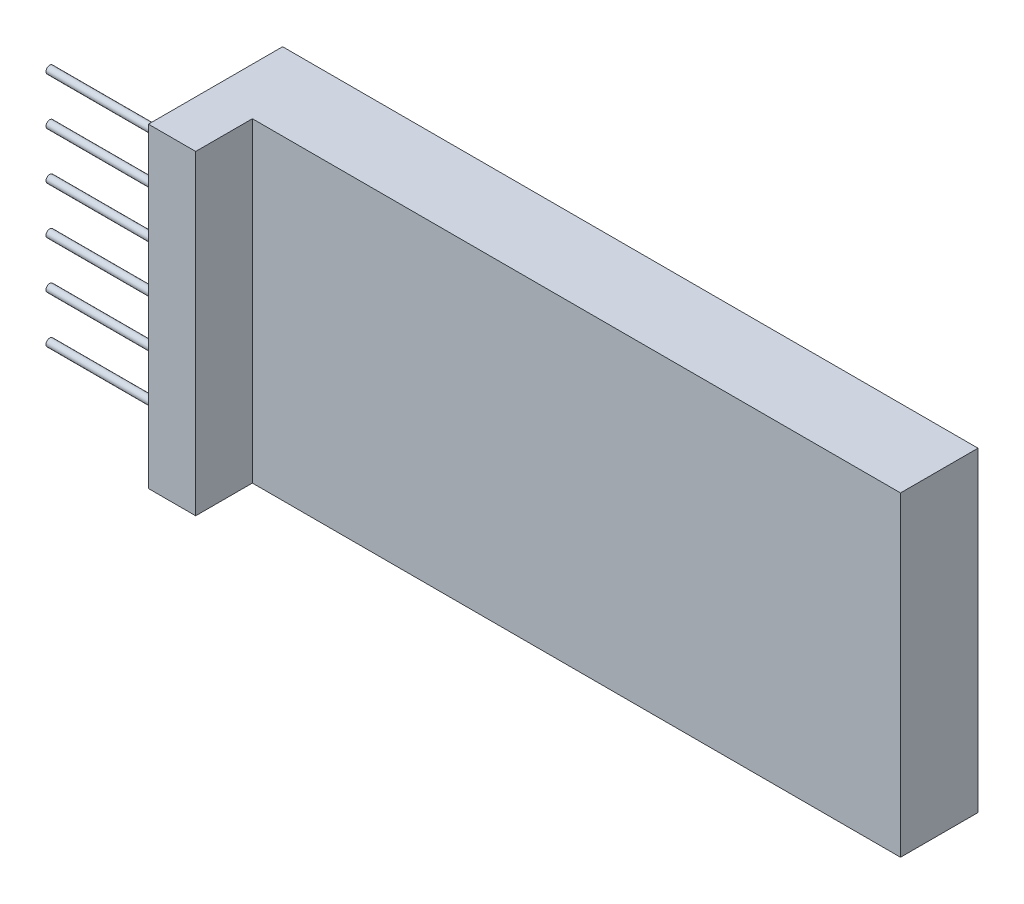
ISO-10303-21;
HEADER;
FILE_DESCRIPTION(('STEP AP214'),'2;1');
FILE_NAME('part.step','',(''),(''),'','','');
FILE_SCHEMA(('AUTOMOTIVE_DESIGN { 1 0 10303 214 1 1 1 1 }'));
ENDSEC;
DATA;
#1=APPLICATION_CONTEXT('core data for automotive mechanical design processes');
#2=APPLICATION_PROTOCOL_DEFINITION('international standard','automotive_design',2000,#1);
#3=PRODUCT_CONTEXT('',#1,'mechanical');
#4=PRODUCT('Part','Part','',(#3));
#5=PRODUCT_RELATED_PRODUCT_CATEGORY('part','',(#4));
#6=PRODUCT_DEFINITION_FORMATION('','',#4);
#7=PRODUCT_DEFINITION_CONTEXT('part definition',#1,'design');
#8=PRODUCT_DEFINITION('design','',#6,#7);
#9=PRODUCT_DEFINITION_SHAPE('','',#8);
#10=(LENGTH_UNIT() NAMED_UNIT(*) SI_UNIT(.MILLI.,.METRE.));
#11=(NAMED_UNIT(*) PLANE_ANGLE_UNIT() SI_UNIT($,.RADIAN.));
#12=(NAMED_UNIT(*) SI_UNIT($,.STERADIAN.) SOLID_ANGLE_UNIT());
#13=UNCERTAINTY_MEASURE_WITH_UNIT(LENGTH_MEASURE(1.E-05),#10,'distance_accuracy_value','');
#14=(GEOMETRIC_REPRESENTATION_CONTEXT(3) GLOBAL_UNCERTAINTY_ASSIGNED_CONTEXT((#13)) GLOBAL_UNIT_ASSIGNED_CONTEXT((#10,
#11,#12)) REPRESENTATION_CONTEXT('',''));
#15=CARTESIAN_POINT('',(0.,0.,0.));
#16=DIRECTION('',(0.,0.,1.));
#17=DIRECTION('',(1.,0.,0.));
#18=AXIS2_PLACEMENT_3D('',#15,#16,#17);
#19=CARTESIAN_POINT('',(0.,0.,4.1));
#20=DIRECTION('',(0.,0.,-1.));
#21=DIRECTION('',(-1.,0.,0.));
#22=AXIS2_PLACEMENT_3D('',#19,#20,#21);
#23=PLANE('',#22);
#24=DIRECTION('',(0.,1.,0.));
#25=VECTOR('',#24,1.);
#26=CARTESIAN_POINT('',(2.5,16.7,4.1));
#27=LINE('',#26,#25);
#28=CARTESIAN_POINT('',(2.5,0.,4.1));
#29=VERTEX_POINT('',#28);
#30=CARTESIAN_POINT('',(2.5,16.7,4.1));
#31=VERTEX_POINT('',#30);
#32=EDGE_CURVE('E50',#29,#31,#27,.T.);
#33=ORIENTED_EDGE('',*,*,#32,.F.);
#34=DIRECTION('',(1.,0.,0.));
#35=VECTOR('',#34,1.);
#36=CARTESIAN_POINT('',(0.,0.,4.1));
#37=LINE('',#36,#35);
#38=CARTESIAN_POINT('',(36.8,0.,4.1));
#39=VERTEX_POINT('',#38);
#40=EDGE_CURVE('E87',#29,#39,#37,.T.);
#41=ORIENTED_EDGE('',*,*,#40,.T.);
#42=DIRECTION('',(0.,1.,0.));
#43=VECTOR('',#42,1.);
#44=CARTESIAN_POINT('',(36.8,0.,4.1));
#45=LINE('',#44,#43);
#46=CARTESIAN_POINT('',(36.8,16.7,4.1));
#47=VERTEX_POINT('',#46);
#48=EDGE_CURVE('E56',#39,#47,#45,.T.);
#49=ORIENTED_EDGE('',*,*,#48,.T.);
#50=DIRECTION('',(-1.,0.,0.));
#51=VECTOR('',#50,1.);
#52=CARTESIAN_POINT('',(0.,16.7,4.1));
#53=LINE('',#52,#51);
#54=EDGE_CURVE('E97',#47,#31,#53,.T.);
#55=ORIENTED_EDGE('',*,*,#54,.T.);
#56=EDGE_LOOP('',(#33,#41,#49,#55));
#57=FACE_BOUND('',#56,.T.);
#58=ADVANCED_FACE('F35',(#57),#23,.F.);
#59=CARTESIAN_POINT('',(0.,0.,4.1));
#60=DIRECTION('',(1.,0.,0.));
#61=DIRECTION('',(0.,0.,-1.));
#62=AXIS2_PLACEMENT_3D('',#59,#60,#61);
#63=PLANE('',#62);
#64=CARTESIAN_POINT('',(0.,2.66451848105115,5.67130025329441));
#65=DIRECTION('',(1.,0.,0.));
#66=DIRECTION('',(0.,0.,-1.));
#67=AXIS2_PLACEMENT_3D('',#64,#65,#66);
#68=CIRCLE('',#67,0.2);
#69=CARTESIAN_POINT('',(0.,2.66451848105115,5.47130025329441));
#70=VERTEX_POINT('',#69);
#71=EDGE_CURVE('E11',#70,#70,#68,.F.);
#72=ORIENTED_EDGE('',*,*,#71,.F.);
#73=EDGE_LOOP('',(#72));
#74=FACE_BOUND('',#73,.T.);
#75=CARTESIAN_POINT('',(0.,5.16451848105115,5.67130025329439));
#76=DIRECTION('',(1.,0.,0.));
#77=DIRECTION('',(0.,0.,-1.));
#78=AXIS2_PLACEMENT_3D('',#75,#76,#77);
#79=CIRCLE('',#78,0.2);
#80=CARTESIAN_POINT('',(0.,5.16451848105115,5.47130025329439));
#81=VERTEX_POINT('',#80);
#82=EDGE_CURVE('E43',#81,#81,#79,.F.);
#83=ORIENTED_EDGE('',*,*,#82,.F.);
#84=EDGE_LOOP('',(#83));
#85=FACE_BOUND('',#84,.T.);
#86=CARTESIAN_POINT('',(0.,7.66451848105115,5.67130025329436));
#87=DIRECTION('',(1.,0.,0.));
#88=DIRECTION('',(0.,0.,-1.));
#89=AXIS2_PLACEMENT_3D('',#86,#87,#88);
#90=CIRCLE('',#89,0.2);
#91=CARTESIAN_POINT('',(0.,7.66451848105115,5.47130025329436));
#92=VERTEX_POINT('',#91);
#93=EDGE_CURVE('E127',#92,#92,#90,.F.);
#94=ORIENTED_EDGE('',*,*,#93,.F.);
#95=EDGE_LOOP('',(#94));
#96=FACE_BOUND('',#95,.T.);
#97=CARTESIAN_POINT('',(0.,10.1645184810511,5.67130025329433));
#98=DIRECTION('',(1.,0.,0.));
#99=DIRECTION('',(0.,0.,-1.));
#100=AXIS2_PLACEMENT_3D('',#97,#98,#99);
#101=CIRCLE('',#100,0.199999999999999);
#102=CARTESIAN_POINT('',(0.,10.1645184810511,5.47130025329433));
#103=VERTEX_POINT('',#102);
#104=EDGE_CURVE('E124',#103,#103,#101,.F.);
#105=ORIENTED_EDGE('',*,*,#104,.F.);
#106=EDGE_LOOP('',(#105));
#107=FACE_BOUND('',#106,.T.);
#108=CARTESIAN_POINT('',(0.,12.6645184810511,5.67130025329431));
#109=DIRECTION('',(1.,0.,0.));
#110=DIRECTION('',(0.,0.,-1.));
#111=AXIS2_PLACEMENT_3D('',#108,#109,#110);
#112=CIRCLE('',#111,0.2);
#113=CARTESIAN_POINT('',(0.,12.6645184810511,5.47130025329431));
#114=VERTEX_POINT('',#113);
#115=EDGE_CURVE('E121',#114,#114,#112,.F.);
#116=ORIENTED_EDGE('',*,*,#115,.F.);
#117=EDGE_LOOP('',(#116));
#118=FACE_BOUND('',#117,.T.);
#119=CARTESIAN_POINT('',(0.,15.1645184810511,5.67130025329428));
#120=DIRECTION('',(1.,0.,0.));
#121=DIRECTION('',(0.,0.,-1.));
#122=AXIS2_PLACEMENT_3D('',#119,#120,#121);
#123=CIRCLE('',#122,0.2);
#124=CARTESIAN_POINT('',(0.,15.1645184810511,5.47130025329428));
#125=VERTEX_POINT('',#124);
#126=EDGE_CURVE('E118',#125,#125,#123,.F.);
#127=ORIENTED_EDGE('',*,*,#126,.F.);
#128=EDGE_LOOP('',(#127));
#129=FACE_BOUND('',#128,.T.);
#130=DIRECTION('',(0.,-1.,0.));
#131=VECTOR('',#130,1.);
#132=CARTESIAN_POINT('',(0.,0.,0.));
#133=LINE('',#132,#131);
#134=CARTESIAN_POINT('',(0.,16.7,0.));
#135=VERTEX_POINT('',#134);
#136=CARTESIAN_POINT('',(0.,0.,0.));
#137=VERTEX_POINT('',#136);
#138=EDGE_CURVE('E94',#135,#137,#133,.T.);
#139=ORIENTED_EDGE('',*,*,#138,.T.);
#140=DIRECTION('',(0.,0.,-1.));
#141=VECTOR('',#140,1.);
#142=CARTESIAN_POINT('',(0.,0.,4.1));
#143=LINE('',#142,#141);
#144=CARTESIAN_POINT('',(0.,0.,7.1));
#145=VERTEX_POINT('',#144);
#146=EDGE_CURVE('E116',#145,#137,#143,.T.);
#147=ORIENTED_EDGE('',*,*,#146,.F.);
#148=DIRECTION('',(0.,-1.,0.));
#149=VECTOR('',#148,1.);
#150=CARTESIAN_POINT('',(0.,16.7,7.1));
#151=LINE('',#150,#149);
#152=CARTESIAN_POINT('',(0.,16.7,7.1));
#153=VERTEX_POINT('',#152);
#154=EDGE_CURVE('E96',#153,#145,#151,.T.);
#155=ORIENTED_EDGE('',*,*,#154,.F.);
#156=DIRECTION('',(0.,0.,-1.));
#157=VECTOR('',#156,1.);
#158=CARTESIAN_POINT('',(0.,16.7,4.1));
#159=LINE('',#158,#157);
#160=EDGE_CURVE('E80',#153,#135,#159,.T.);
#161=ORIENTED_EDGE('',*,*,#160,.T.);
#162=EDGE_LOOP('',(#139,#147,#155,#161));
#163=FACE_BOUND('',#162,.T.);
#164=ADVANCED_FACE('F37',(#74,#85,#96,#107,#118,#129,#163),#63,.F.);
#165=CARTESIAN_POINT('',(0.,0.,4.1));
#166=DIRECTION('',(0.,1.,0.));
#167=DIRECTION('',(0.,0.,1.));
#168=AXIS2_PLACEMENT_3D('',#165,#166,#167);
#169=PLANE('',#168);
#170=DIRECTION('',(1.,0.,0.));
#171=VECTOR('',#170,1.);
#172=CARTESIAN_POINT('',(0.,0.,0.));
#173=LINE('',#172,#171);
#174=CARTESIAN_POINT('',(36.8,0.,0.));
#175=VERTEX_POINT('',#174);
#176=EDGE_CURVE('E100',#137,#175,#173,.T.);
#177=ORIENTED_EDGE('',*,*,#176,.T.);
#178=DIRECTION('',(0.,0.,-1.));
#179=VECTOR('',#178,1.);
#180=CARTESIAN_POINT('',(36.8,0.,4.1));
#181=LINE('',#180,#179);
#182=EDGE_CURVE('E113',#39,#175,#181,.T.);
#183=ORIENTED_EDGE('',*,*,#182,.F.);
#184=ORIENTED_EDGE('',*,*,#40,.F.);
#185=DIRECTION('',(0.,0.,-1.));
#186=VECTOR('',#185,1.);
#187=CARTESIAN_POINT('',(2.5,0.,7.1));
#188=LINE('',#187,#186);
#189=CARTESIAN_POINT('',(2.5,0.,7.1));
#190=VERTEX_POINT('',#189);
#191=EDGE_CURVE('E102',#190,#29,#188,.T.);
#192=ORIENTED_EDGE('',*,*,#191,.F.);
#193=DIRECTION('',(1.,0.,0.));
#194=VECTOR('',#193,1.);
#195=CARTESIAN_POINT('',(0.,0.,7.1));
#196=LINE('',#195,#194);
#197=EDGE_CURVE('E193',#145,#190,#196,.T.);
#198=ORIENTED_EDGE('',*,*,#197,.F.);
#199=ORIENTED_EDGE('',*,*,#146,.T.);
#200=EDGE_LOOP('',(#177,#183,#184,#192,#198,#199));
#201=FACE_BOUND('',#200,.T.);
#202=ADVANCED_FACE('F136',(#201),#169,.F.);
#203=CARTESIAN_POINT('',(36.8,0.,4.1));
#204=DIRECTION('',(-1.,0.,0.));
#205=DIRECTION('',(0.,0.,1.));
#206=AXIS2_PLACEMENT_3D('',#203,#204,#205);
#207=PLANE('',#206);
#208=DIRECTION('',(0.,1.,0.));
#209=VECTOR('',#208,1.);
#210=CARTESIAN_POINT('',(36.8,0.,0.));
#211=LINE('',#210,#209);
#212=CARTESIAN_POINT('',(36.8,16.7,0.));
#213=VERTEX_POINT('',#212);
#214=EDGE_CURVE('E88',#175,#213,#211,.T.);
#215=ORIENTED_EDGE('',*,*,#214,.T.);
#216=DIRECTION('',(0.,0.,-1.));
#217=VECTOR('',#216,1.);
#218=CARTESIAN_POINT('',(36.8,16.7,4.1));
#219=LINE('',#218,#217);
#220=EDGE_CURVE('E83',#47,#213,#219,.T.);
#221=ORIENTED_EDGE('',*,*,#220,.F.);
#222=ORIENTED_EDGE('',*,*,#48,.F.);
#223=ORIENTED_EDGE('',*,*,#182,.T.);
#224=EDGE_LOOP('',(#215,#221,#222,#223));
#225=FACE_BOUND('',#224,.T.);
#226=ADVANCED_FACE('F173',(#225),#207,.F.);
#227=CARTESIAN_POINT('',(0.,16.7,4.1));
#228=DIRECTION('',(0.,-1.,0.));
#229=DIRECTION('',(0.,0.,-1.));
#230=AXIS2_PLACEMENT_3D('',#227,#228,#229);
#231=PLANE('',#230);
#232=DIRECTION('',(-1.,0.,0.));
#233=VECTOR('',#232,1.);
#234=CARTESIAN_POINT('',(0.,16.7,0.));
#235=LINE('',#234,#233);
#236=EDGE_CURVE('E76',#213,#135,#235,.T.);
#237=ORIENTED_EDGE('',*,*,#236,.T.);
#238=ORIENTED_EDGE('',*,*,#160,.F.);
#239=DIRECTION('',(-1.,0.,0.));
#240=VECTOR('',#239,1.);
#241=CARTESIAN_POINT('',(0.,16.7,7.1));
#242=LINE('',#241,#240);
#243=CARTESIAN_POINT('',(2.5,16.7,7.1));
#244=VERTEX_POINT('',#243);
#245=EDGE_CURVE('E186',#244,#153,#242,.T.);
#246=ORIENTED_EDGE('',*,*,#245,.F.);
#247=DIRECTION('',(0.,0.,-1.));
#248=VECTOR('',#247,1.);
#249=CARTESIAN_POINT('',(2.5,16.7,7.1));
#250=LINE('',#249,#248);
#251=EDGE_CURVE('E106',#244,#31,#250,.T.);
#252=ORIENTED_EDGE('',*,*,#251,.T.);
#253=ORIENTED_EDGE('',*,*,#54,.F.);
#254=ORIENTED_EDGE('',*,*,#220,.T.);
#255=EDGE_LOOP('',(#237,#238,#246,#252,#253,#254));
#256=FACE_BOUND('',#255,.T.);
#257=ADVANCED_FACE('F78',(#256),#231,.F.);
#258=CARTESIAN_POINT('',(0.,0.,0.));
#259=DIRECTION('',(0.,0.,-1.));
#260=DIRECTION('',(-1.,0.,0.));
#261=AXIS2_PLACEMENT_3D('',#258,#259,#260);
#262=PLANE('',#261);
#263=ORIENTED_EDGE('',*,*,#138,.F.);
#264=ORIENTED_EDGE('',*,*,#236,.F.);
#265=ORIENTED_EDGE('',*,*,#214,.F.);
#266=ORIENTED_EDGE('',*,*,#176,.F.);
#267=EDGE_LOOP('',(#263,#264,#265,#266));
#268=FACE_BOUND('',#267,.T.);
#269=ADVANCED_FACE('F99',(#268),#262,.T.);
#270=CARTESIAN_POINT('',(2.5,16.7,7.1));
#271=DIRECTION('',(-1.,0.,0.));
#272=DIRECTION('',(0.,-1.,0.));
#273=AXIS2_PLACEMENT_3D('',#270,#271,#272);
#274=PLANE('',#273);
#275=ORIENTED_EDGE('',*,*,#32,.T.);
#276=ORIENTED_EDGE('',*,*,#251,.F.);
#277=DIRECTION('',(0.,1.,0.));
#278=VECTOR('',#277,1.);
#279=CARTESIAN_POINT('',(2.5,16.7,7.1));
#280=LINE('',#279,#278);
#281=EDGE_CURVE('E190',#190,#244,#280,.T.);
#282=ORIENTED_EDGE('',*,*,#281,.F.);
#283=ORIENTED_EDGE('',*,*,#191,.T.);
#284=EDGE_LOOP('',(#275,#276,#282,#283));
#285=FACE_BOUND('',#284,.T.);
#286=ADVANCED_FACE('F159',(#285),#274,.F.);
#287=CARTESIAN_POINT('',(0.,0.,7.1));
#288=DIRECTION('',(0.,0.,1.));
#289=DIRECTION('',(1.,0.,0.));
#290=AXIS2_PLACEMENT_3D('',#287,#288,#289);
#291=PLANE('',#290);
#292=ORIENTED_EDGE('',*,*,#154,.T.);
#293=ORIENTED_EDGE('',*,*,#197,.T.);
#294=ORIENTED_EDGE('',*,*,#281,.T.);
#295=ORIENTED_EDGE('',*,*,#245,.T.);
#296=EDGE_LOOP('',(#292,#293,#294,#295));
#297=FACE_BOUND('',#296,.T.);
#298=ADVANCED_FACE('F149',(#297),#291,.T.);
#299=CARTESIAN_POINT('',(-6.65,15.1645184810511,5.67130025329428));
#300=DIRECTION('',(1.,0.,0.));
#301=DIRECTION('',(0.,0.,-1.));
#302=AXIS2_PLACEMENT_3D('',#299,#300,#301);
#303=CYLINDRICAL_SURFACE('',#302,0.2);
#304=CARTESIAN_POINT('',(-6.65,15.1645184810511,5.67130025329428));
#305=DIRECTION('',(-1.,0.,0.));
#306=DIRECTION('',(0.,0.,1.));
#307=AXIS2_PLACEMENT_3D('',#304,#305,#306);
#308=CIRCLE('',#307,0.2);
#309=CARTESIAN_POINT('',(-6.65,15.1645184810511,5.87130025329428));
#310=VERTEX_POINT('',#309);
#311=EDGE_CURVE('E188',#310,#310,#308,.T.);
#312=ORIENTED_EDGE('',*,*,#311,.F.);
#313=EDGE_LOOP('',(#312));
#314=FACE_BOUND('',#313,.T.);
#315=ORIENTED_EDGE('',*,*,#126,.T.);
#316=EDGE_LOOP('',(#315));
#317=FACE_BOUND('',#316,.T.);
#318=ADVANCED_FACE('F146',(#314,#317),#303,.T.);
#319=CARTESIAN_POINT('',(-6.65,15.1645184810511,5.67130025329428));
#320=DIRECTION('',(-1.,0.,0.));
#321=DIRECTION('',(0.,0.,1.));
#322=AXIS2_PLACEMENT_3D('',#319,#320,#321);
#323=PLANE('',#322);
#324=ORIENTED_EDGE('',*,*,#311,.T.);
#325=EDGE_LOOP('',(#324));
#326=FACE_BOUND('',#325,.T.);
#327=ADVANCED_FACE('F148',(#326),#323,.T.);
#328=CARTESIAN_POINT('',(-6.65,12.6645184810511,5.67130025329431));
#329=DIRECTION('',(1.,0.,0.));
#330=DIRECTION('',(0.,0.,-1.));
#331=AXIS2_PLACEMENT_3D('',#328,#329,#330);
#332=CYLINDRICAL_SURFACE('',#331,0.2);
#333=CARTESIAN_POINT('',(-6.65,12.6645184810511,5.67130025329431));
#334=DIRECTION('',(-1.,0.,0.));
#335=DIRECTION('',(0.,0.,1.));
#336=AXIS2_PLACEMENT_3D('',#333,#334,#335);
#337=CIRCLE('',#336,0.2);
#338=CARTESIAN_POINT('',(-6.65,12.6645184810511,5.87130025329431));
#339=VERTEX_POINT('',#338);
#340=EDGE_CURVE('E199',#339,#339,#337,.T.);
#341=ORIENTED_EDGE('',*,*,#340,.F.);
#342=EDGE_LOOP('',(#341));
#343=FACE_BOUND('',#342,.T.);
#344=ORIENTED_EDGE('',*,*,#115,.T.);
#345=EDGE_LOOP('',(#344));
#346=FACE_BOUND('',#345,.T.);
#347=ADVANCED_FACE('F156',(#343,#346),#332,.T.);
#348=CARTESIAN_POINT('',(-6.65,12.6645184810511,5.67130025329431));
#349=DIRECTION('',(-1.,0.,0.));
#350=DIRECTION('',(0.,0.,1.));
#351=AXIS2_PLACEMENT_3D('',#348,#349,#350);
#352=PLANE('',#351);
#353=ORIENTED_EDGE('',*,*,#340,.T.);
#354=EDGE_LOOP('',(#353));
#355=FACE_BOUND('',#354,.T.);
#356=ADVANCED_FACE('F249',(#355),#352,.T.);
#357=CARTESIAN_POINT('',(-6.65,10.1645184810511,5.67130025329433));
#358=DIRECTION('',(1.,0.,0.));
#359=DIRECTION('',(0.,0.,-1.));
#360=AXIS2_PLACEMENT_3D('',#357,#358,#359);
#361=CYLINDRICAL_SURFACE('',#360,0.199999999999999);
#362=CARTESIAN_POINT('',(-6.65,10.1645184810511,5.67130025329433));
#363=DIRECTION('',(-1.,0.,0.));
#364=DIRECTION('',(0.,0.,1.));
#365=AXIS2_PLACEMENT_3D('',#362,#363,#364);
#366=CIRCLE('',#365,0.199999999999999);
#367=CARTESIAN_POINT('',(-6.65,10.1645184810511,5.87130025329433));
#368=VERTEX_POINT('',#367);
#369=EDGE_CURVE('E202',#368,#368,#366,.T.);
#370=ORIENTED_EDGE('',*,*,#369,.F.);
#371=EDGE_LOOP('',(#370));
#372=FACE_BOUND('',#371,.T.);
#373=ORIENTED_EDGE('',*,*,#104,.T.);
#374=EDGE_LOOP('',(#373));
#375=FACE_BOUND('',#374,.T.);
#376=ADVANCED_FACE('F245',(#372,#375),#361,.T.);
#377=CARTESIAN_POINT('',(-6.65,10.1645184810511,5.67130025329433));
#378=DIRECTION('',(-1.,0.,0.));
#379=DIRECTION('',(0.,0.,1.));
#380=AXIS2_PLACEMENT_3D('',#377,#378,#379);
#381=PLANE('',#380);
#382=ORIENTED_EDGE('',*,*,#369,.T.);
#383=EDGE_LOOP('',(#382));
#384=FACE_BOUND('',#383,.T.);
#385=ADVANCED_FACE('F241',(#384),#381,.T.);
#386=CARTESIAN_POINT('',(-6.65,7.66451848105115,5.67130025329436));
#387=DIRECTION('',(1.,0.,0.));
#388=DIRECTION('',(0.,0.,-1.));
#389=AXIS2_PLACEMENT_3D('',#386,#387,#388);
#390=CYLINDRICAL_SURFACE('',#389,0.2);
#391=CARTESIAN_POINT('',(-6.65,7.66451848105115,5.67130025329436));
#392=DIRECTION('',(-1.,0.,0.));
#393=DIRECTION('',(0.,0.,1.));
#394=AXIS2_PLACEMENT_3D('',#391,#392,#393);
#395=CIRCLE('',#394,0.2);
#396=CARTESIAN_POINT('',(-6.65,7.66451848105115,5.87130025329436));
#397=VERTEX_POINT('',#396);
#398=EDGE_CURVE('E205',#397,#397,#395,.T.);
#399=ORIENTED_EDGE('',*,*,#398,.F.);
#400=EDGE_LOOP('',(#399));
#401=FACE_BOUND('',#400,.T.);
#402=ORIENTED_EDGE('',*,*,#93,.T.);
#403=EDGE_LOOP('',(#402));
#404=FACE_BOUND('',#403,.T.);
#405=ADVANCED_FACE('F237',(#401,#404),#390,.T.);
#406=CARTESIAN_POINT('',(-6.65,7.66451848105115,5.67130025329436));
#407=DIRECTION('',(-1.,0.,0.));
#408=DIRECTION('',(0.,0.,1.));
#409=AXIS2_PLACEMENT_3D('',#406,#407,#408);
#410=PLANE('',#409);
#411=ORIENTED_EDGE('',*,*,#398,.T.);
#412=EDGE_LOOP('',(#411));
#413=FACE_BOUND('',#412,.T.);
#414=ADVANCED_FACE('F233',(#413),#410,.T.);
#415=CARTESIAN_POINT('',(-6.65,5.16451848105115,5.67130025329439));
#416=DIRECTION('',(1.,0.,0.));
#417=DIRECTION('',(0.,0.,-1.));
#418=AXIS2_PLACEMENT_3D('',#415,#416,#417);
#419=CYLINDRICAL_SURFACE('',#418,0.2);
#420=CARTESIAN_POINT('',(-6.65,5.16451848105115,5.67130025329439));
#421=DIRECTION('',(-1.,0.,0.));
#422=DIRECTION('',(0.,0.,1.));
#423=AXIS2_PLACEMENT_3D('',#420,#421,#422);
#424=CIRCLE('',#423,0.2);
#425=CARTESIAN_POINT('',(-6.65,5.16451848105115,5.87130025329439));
#426=VERTEX_POINT('',#425);
#427=EDGE_CURVE('E208',#426,#426,#424,.T.);
#428=ORIENTED_EDGE('',*,*,#427,.F.);
#429=EDGE_LOOP('',(#428));
#430=FACE_BOUND('',#429,.T.);
#431=ORIENTED_EDGE('',*,*,#82,.T.);
#432=EDGE_LOOP('',(#431));
#433=FACE_BOUND('',#432,.T.);
#434=ADVANCED_FACE('F132',(#430,#433),#419,.T.);
#435=CARTESIAN_POINT('',(-6.65,5.16451848105115,5.67130025329439));
#436=DIRECTION('',(-1.,0.,0.));
#437=DIRECTION('',(0.,0.,1.));
#438=AXIS2_PLACEMENT_3D('',#435,#436,#437);
#439=PLANE('',#438);
#440=ORIENTED_EDGE('',*,*,#427,.T.);
#441=EDGE_LOOP('',(#440));
#442=FACE_BOUND('',#441,.T.);
#443=ADVANCED_FACE('F220',(#442),#439,.T.);
#444=CARTESIAN_POINT('',(-6.65,2.66451848105115,5.67130025329441));
#445=DIRECTION('',(1.,0.,0.));
#446=DIRECTION('',(0.,0.,-1.));
#447=AXIS2_PLACEMENT_3D('',#444,#445,#446);
#448=CYLINDRICAL_SURFACE('',#447,0.2);
#449=CARTESIAN_POINT('',(-6.65,2.66451848105115,5.67130025329441));
#450=DIRECTION('',(-1.,0.,0.));
#451=DIRECTION('',(0.,0.,1.));
#452=AXIS2_PLACEMENT_3D('',#449,#450,#451);
#453=CIRCLE('',#452,0.2);
#454=CARTESIAN_POINT('',(-6.65,2.66451848105115,5.87130025329441));
#455=VERTEX_POINT('',#454);
#456=EDGE_CURVE('E211',#455,#455,#453,.T.);
#457=ORIENTED_EDGE('',*,*,#456,.F.);
#458=EDGE_LOOP('',(#457));
#459=FACE_BOUND('',#458,.T.);
#460=ORIENTED_EDGE('',*,*,#71,.T.);
#461=EDGE_LOOP('',(#460));
#462=FACE_BOUND('',#461,.T.);
#463=ADVANCED_FACE('F217',(#459,#462),#448,.T.);
#464=CARTESIAN_POINT('',(-6.65,2.66451848105115,5.67130025329441));
#465=DIRECTION('',(-1.,0.,0.));
#466=DIRECTION('',(0.,0.,1.));
#467=AXIS2_PLACEMENT_3D('',#464,#465,#466);
#468=PLANE('',#467);
#469=ORIENTED_EDGE('',*,*,#456,.T.);
#470=EDGE_LOOP('',(#469));
#471=FACE_BOUND('',#470,.T.);
#472=ADVANCED_FACE('F215',(#471),#468,.T.);
#473=CLOSED_SHELL('',(#58,#164,#202,#226,#257,#269,#286,#298,#318,#327,#347,#356,#376,#385,#405,
#414,#434,#443,#463,#472));
#474=MANIFOLD_SOLID_BREP('B2',#473);
#475=ADVANCED_BREP_SHAPE_REPRESENTATION('',(#18,#474),#14);
#476=SHAPE_DEFINITION_REPRESENTATION(#9,#475);
ENDSEC;
END-ISO-10303-21;
